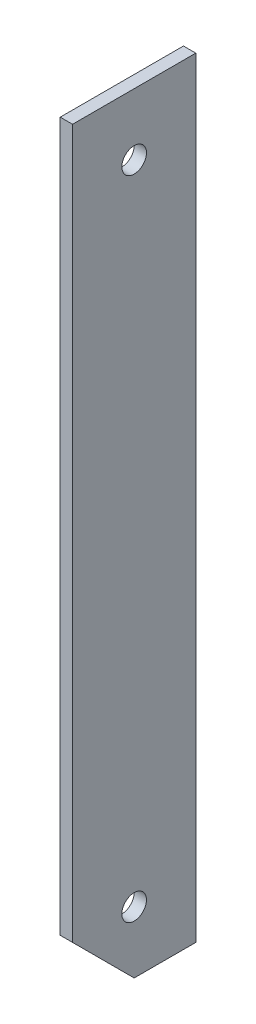
ISO-10303-21;
HEADER;
FILE_DESCRIPTION(('STEP AP214'),'2;1');
FILE_NAME('part.step','',(''),(''),'','','');
FILE_SCHEMA(('AUTOMOTIVE_DESIGN { 1 0 10303 214 1 1 1 1 }'));
ENDSEC;
DATA;
#1=APPLICATION_CONTEXT('core data for automotive mechanical design processes');
#2=APPLICATION_PROTOCOL_DEFINITION('international standard','automotive_design',2000,#1);
#3=PRODUCT_CONTEXT('',#1,'mechanical');
#4=PRODUCT('Part','Part','',(#3));
#5=PRODUCT_RELATED_PRODUCT_CATEGORY('part','',(#4));
#6=PRODUCT_DEFINITION_FORMATION('','',#4);
#7=PRODUCT_DEFINITION_CONTEXT('part definition',#1,'design');
#8=PRODUCT_DEFINITION('design','',#6,#7);
#9=PRODUCT_DEFINITION_SHAPE('','',#8);
#10=(LENGTH_UNIT() NAMED_UNIT(*) SI_UNIT(.MILLI.,.METRE.));
#11=(NAMED_UNIT(*) PLANE_ANGLE_UNIT() SI_UNIT($,.RADIAN.));
#12=(NAMED_UNIT(*) SI_UNIT($,.STERADIAN.) SOLID_ANGLE_UNIT());
#13=UNCERTAINTY_MEASURE_WITH_UNIT(LENGTH_MEASURE(1.E-05),#10,'distance_accuracy_value','');
#14=(GEOMETRIC_REPRESENTATION_CONTEXT(3) GLOBAL_UNCERTAINTY_ASSIGNED_CONTEXT((#13)) GLOBAL_UNIT_ASSIGNED_CONTEXT((#10,
#11,#12)) REPRESENTATION_CONTEXT('',''));
#15=CARTESIAN_POINT('',(0.,0.,0.));
#16=DIRECTION('',(0.,0.,1.));
#17=DIRECTION('',(1.,0.,0.));
#18=AXIS2_PLACEMENT_3D('',#15,#16,#17);
#19=CARTESIAN_POINT('',(4.,0.,0.));
#20=DIRECTION('',(1.,0.,0.));
#21=DIRECTION('',(0.,0.,-1.));
#22=AXIS2_PLACEMENT_3D('',#19,#20,#21);
#23=PLANE('',#22);
#24=CARTESIAN_POINT('',(4.,105.,0.));
#25=DIRECTION('',(1.,0.,0.));
#26=DIRECTION('',(0.,0.,-1.));
#27=AXIS2_PLACEMENT_3D('',#24,#25,#26);
#28=CIRCLE('',#27,4.00000000000001);
#29=CARTESIAN_POINT('',(4.,105.,-3.99999999999998));
#30=VERTEX_POINT('',#29);
#31=EDGE_CURVE('E140',#30,#30,#28,.T.);
#32=ORIENTED_EDGE('',*,*,#31,.F.);
#33=EDGE_LOOP('',(#32));
#34=FACE_BOUND('',#33,.T.);
#35=DIRECTION('',(0.,-1.,0.));
#36=VECTOR('',#35,1.);
#37=CARTESIAN_POINT('',(4.,125.,20.));
#38=LINE('',#37,#36);
#39=CARTESIAN_POINT('',(4.,125.,20.));
#40=VERTEX_POINT('',#39);
#41=CARTESIAN_POINT('',(4.,-105.,20.));
#42=VERTEX_POINT('',#41);
#43=EDGE_CURVE('E99',#40,#42,#38,.T.);
#44=ORIENTED_EDGE('',*,*,#43,.T.);
#45=DIRECTION('',(0.,0.707106781186548,0.707106781186547));
#46=VECTOR('',#45,1.);
#47=CARTESIAN_POINT('',(4.,-62.4999999999998,62.4999999999999));
#48=LINE('',#47,#46);
#49=CARTESIAN_POINT('',(4.,-125.,0.));
#50=VERTEX_POINT('',#49);
#51=EDGE_CURVE('E11',#42,#50,#48,.F.);
#52=ORIENTED_EDGE('',*,*,#51,.T.);
#53=DIRECTION('',(0.,0.,-1.));
#54=VECTOR('',#53,1.);
#55=CARTESIAN_POINT('',(4.,-125.,20.));
#56=LINE('',#55,#54);
#57=CARTESIAN_POINT('',(4.,-125.,-20.));
#58=VERTEX_POINT('',#57);
#59=EDGE_CURVE('E105',#50,#58,#56,.T.);
#60=ORIENTED_EDGE('',*,*,#59,.T.);
#61=DIRECTION('',(0.,1.,0.));
#62=VECTOR('',#61,1.);
#63=CARTESIAN_POINT('',(4.,125.,-20.));
#64=LINE('',#63,#62);
#65=CARTESIAN_POINT('',(4.,125.,-20.));
#66=VERTEX_POINT('',#65);
#67=EDGE_CURVE('E100',#58,#66,#64,.T.);
#68=ORIENTED_EDGE('',*,*,#67,.T.);
#69=DIRECTION('',(0.,0.,1.));
#70=VECTOR('',#69,1.);
#71=CARTESIAN_POINT('',(4.,125.,20.));
#72=LINE('',#71,#70);
#73=EDGE_CURVE('E89',#66,#40,#72,.T.);
#74=ORIENTED_EDGE('',*,*,#73,.T.);
#75=EDGE_LOOP('',(#44,#52,#60,#68,#74));
#76=FACE_BOUND('',#75,.T.);
#77=CARTESIAN_POINT('',(4.,-105.,0.));
#78=DIRECTION('',(1.,0.,0.));
#79=DIRECTION('',(0.,0.,-1.));
#80=AXIS2_PLACEMENT_3D('',#77,#78,#79);
#81=CIRCLE('',#80,4.00000000000001);
#82=CARTESIAN_POINT('',(4.,-105.,-4.00000000000004));
#83=VERTEX_POINT('',#82);
#84=EDGE_CURVE('E149',#83,#83,#81,.T.);
#85=ORIENTED_EDGE('',*,*,#84,.F.);
#86=EDGE_LOOP('',(#85));
#87=FACE_BOUND('',#86,.T.);
#88=ADVANCED_FACE('F41',(#34,#76,#87),#23,.T.);
#89=CARTESIAN_POINT('',(0.,0.,0.));
#90=DIRECTION('',(1.,0.,0.));
#91=DIRECTION('',(0.,0.,-1.));
#92=AXIS2_PLACEMENT_3D('',#89,#90,#91);
#93=PLANE('',#92);
#94=DIRECTION('',(0.,0.,-1.));
#95=VECTOR('',#94,1.);
#96=CARTESIAN_POINT('',(0.,-125.,20.));
#97=LINE('',#96,#95);
#98=CARTESIAN_POINT('',(0.,-125.,0.));
#99=VERTEX_POINT('',#98);
#100=CARTESIAN_POINT('',(0.,-125.,-20.));
#101=VERTEX_POINT('',#100);
#102=EDGE_CURVE('E110',#99,#101,#97,.T.);
#103=ORIENTED_EDGE('',*,*,#102,.F.);
#104=DIRECTION('',(0.,-0.707106781186548,-0.707106781186547));
#105=VECTOR('',#104,1.);
#106=CARTESIAN_POINT('',(0.,-125.,0.));
#107=LINE('',#106,#105);
#108=CARTESIAN_POINT('',(0.,-105.,20.));
#109=VERTEX_POINT('',#108);
#110=EDGE_CURVE('E64',#99,#109,#107,.F.);
#111=ORIENTED_EDGE('',*,*,#110,.T.);
#112=DIRECTION('',(0.,-1.,0.));
#113=VECTOR('',#112,1.);
#114=CARTESIAN_POINT('',(0.,125.,20.));
#115=LINE('',#114,#113);
#116=CARTESIAN_POINT('',(0.,125.,20.));
#117=VERTEX_POINT('',#116);
#118=EDGE_CURVE('E132',#117,#109,#115,.T.);
#119=ORIENTED_EDGE('',*,*,#118,.F.);
#120=DIRECTION('',(0.,0.,1.));
#121=VECTOR('',#120,1.);
#122=CARTESIAN_POINT('',(0.,125.,20.));
#123=LINE('',#122,#121);
#124=CARTESIAN_POINT('',(0.,125.,-20.));
#125=VERTEX_POINT('',#124);
#126=EDGE_CURVE('E135',#125,#117,#123,.T.);
#127=ORIENTED_EDGE('',*,*,#126,.F.);
#128=DIRECTION('',(0.,1.,0.));
#129=VECTOR('',#128,1.);
#130=CARTESIAN_POINT('',(0.,125.,-20.));
#131=LINE('',#130,#129);
#132=EDGE_CURVE('E114',#101,#125,#131,.T.);
#133=ORIENTED_EDGE('',*,*,#132,.F.);
#134=EDGE_LOOP('',(#103,#111,#119,#127,#133));
#135=FACE_BOUND('',#134,.T.);
#136=CARTESIAN_POINT('',(0.,105.,0.));
#137=DIRECTION('',(1.,0.,0.));
#138=DIRECTION('',(0.,0.,-1.));
#139=AXIS2_PLACEMENT_3D('',#136,#137,#138);
#140=CIRCLE('',#139,4.00000000000001);
#141=CARTESIAN_POINT('',(0.,105.,-3.99999999999998));
#142=VERTEX_POINT('',#141);
#143=EDGE_CURVE('E145',#142,#142,#140,.T.);
#144=ORIENTED_EDGE('',*,*,#143,.T.);
#145=EDGE_LOOP('',(#144));
#146=FACE_BOUND('',#145,.T.);
#147=CARTESIAN_POINT('',(0.,-105.,0.));
#148=DIRECTION('',(1.,0.,0.));
#149=DIRECTION('',(0.,0.,-1.));
#150=AXIS2_PLACEMENT_3D('',#147,#148,#149);
#151=CIRCLE('',#150,4.00000000000001);
#152=CARTESIAN_POINT('',(0.,-105.,-4.00000000000004));
#153=VERTEX_POINT('',#152);
#154=EDGE_CURVE('E153',#153,#153,#151,.T.);
#155=ORIENTED_EDGE('',*,*,#154,.T.);
#156=EDGE_LOOP('',(#155));
#157=FACE_BOUND('',#156,.T.);
#158=ADVANCED_FACE('F164',(#135,#146,#157),#93,.F.);
#159=CARTESIAN_POINT('',(4.,125.,-20.));
#160=DIRECTION('',(0.,0.,1.));
#161=DIRECTION('',(0.,-1.,0.));
#162=AXIS2_PLACEMENT_3D('',#159,#160,#161);
#163=PLANE('',#162);
#164=ORIENTED_EDGE('',*,*,#132,.T.);
#165=DIRECTION('',(-1.,0.,0.));
#166=VECTOR('',#165,1.);
#167=CARTESIAN_POINT('',(4.,125.,-20.));
#168=LINE('',#167,#166);
#169=EDGE_CURVE('E93',#66,#125,#168,.T.);
#170=ORIENTED_EDGE('',*,*,#169,.F.);
#171=ORIENTED_EDGE('',*,*,#67,.F.);
#172=DIRECTION('',(-1.,0.,0.));
#173=VECTOR('',#172,1.);
#174=CARTESIAN_POINT('',(4.,-125.,-20.));
#175=LINE('',#174,#173);
#176=EDGE_CURVE('E122',#58,#101,#175,.T.);
#177=ORIENTED_EDGE('',*,*,#176,.T.);
#178=EDGE_LOOP('',(#164,#170,#171,#177));
#179=FACE_BOUND('',#178,.T.);
#180=ADVANCED_FACE('F112',(#179),#163,.F.);
#181=CARTESIAN_POINT('',(4.,125.,20.));
#182=DIRECTION('',(0.,-1.,0.));
#183=DIRECTION('',(0.,0.,-1.));
#184=AXIS2_PLACEMENT_3D('',#181,#182,#183);
#185=PLANE('',#184);
#186=ORIENTED_EDGE('',*,*,#126,.T.);
#187=DIRECTION('',(-1.,0.,0.));
#188=VECTOR('',#187,1.);
#189=CARTESIAN_POINT('',(4.,125.,20.));
#190=LINE('',#189,#188);
#191=EDGE_CURVE('E96',#40,#117,#190,.T.);
#192=ORIENTED_EDGE('',*,*,#191,.F.);
#193=ORIENTED_EDGE('',*,*,#73,.F.);
#194=ORIENTED_EDGE('',*,*,#169,.T.);
#195=EDGE_LOOP('',(#186,#192,#193,#194));
#196=FACE_BOUND('',#195,.T.);
#197=ADVANCED_FACE('F91',(#196),#185,.F.);
#198=CARTESIAN_POINT('',(4.,125.,20.));
#199=DIRECTION('',(0.,0.,-1.));
#200=DIRECTION('',(0.,1.,0.));
#201=AXIS2_PLACEMENT_3D('',#198,#199,#200);
#202=PLANE('',#201);
#203=ORIENTED_EDGE('',*,*,#118,.T.);
#204=DIRECTION('',(1.,0.,0.));
#205=VECTOR('',#204,1.);
#206=CARTESIAN_POINT('',(4.,-105.,20.));
#207=LINE('',#206,#205);
#208=EDGE_CURVE('E50',#109,#42,#207,.T.);
#209=ORIENTED_EDGE('',*,*,#208,.T.);
#210=ORIENTED_EDGE('',*,*,#43,.F.);
#211=ORIENTED_EDGE('',*,*,#191,.T.);
#212=EDGE_LOOP('',(#203,#209,#210,#211));
#213=FACE_BOUND('',#212,.T.);
#214=ADVANCED_FACE('F179',(#213),#202,.F.);
#215=CARTESIAN_POINT('',(4.,-125.,20.));
#216=DIRECTION('',(0.,1.,0.));
#217=DIRECTION('',(0.,0.,1.));
#218=AXIS2_PLACEMENT_3D('',#215,#216,#217);
#219=PLANE('',#218);
#220=ORIENTED_EDGE('',*,*,#59,.F.);
#221=DIRECTION('',(-1.,0.,0.));
#222=VECTOR('',#221,1.);
#223=CARTESIAN_POINT('',(4.,-125.,0.));
#224=LINE('',#223,#222);
#225=EDGE_CURVE('E116',#50,#99,#224,.T.);
#226=ORIENTED_EDGE('',*,*,#225,.T.);
#227=ORIENTED_EDGE('',*,*,#102,.T.);
#228=ORIENTED_EDGE('',*,*,#176,.F.);
#229=EDGE_LOOP('',(#220,#226,#227,#228));
#230=FACE_BOUND('',#229,.T.);
#231=ADVANCED_FACE('F176',(#230),#219,.F.);
#232=CARTESIAN_POINT('',(4.,105.,0.));
#233=DIRECTION('',(-1.,0.,0.));
#234=DIRECTION('',(0.,0.,1.));
#235=AXIS2_PLACEMENT_3D('',#232,#233,#234);
#236=CYLINDRICAL_SURFACE('',#235,4.00000000000001);
#237=ORIENTED_EDGE('',*,*,#31,.T.);
#238=EDGE_LOOP('',(#237));
#239=FACE_BOUND('',#238,.T.);
#240=ORIENTED_EDGE('',*,*,#143,.F.);
#241=EDGE_LOOP('',(#240));
#242=FACE_BOUND('',#241,.T.);
#243=ADVANCED_FACE('F173',(#239,#242),#236,.F.);
#244=CARTESIAN_POINT('',(4.,-105.,0.));
#245=DIRECTION('',(-1.,0.,0.));
#246=DIRECTION('',(0.,0.,1.));
#247=AXIS2_PLACEMENT_3D('',#244,#245,#246);
#248=CYLINDRICAL_SURFACE('',#247,4.00000000000001);
#249=ORIENTED_EDGE('',*,*,#84,.T.);
#250=EDGE_LOOP('',(#249));
#251=FACE_BOUND('',#250,.T.);
#252=ORIENTED_EDGE('',*,*,#154,.F.);
#253=EDGE_LOOP('',(#252));
#254=FACE_BOUND('',#253,.T.);
#255=ADVANCED_FACE('F161',(#251,#254),#248,.F.);
#256=CARTESIAN_POINT('',(4.,-125.,0.));
#257=DIRECTION('',(0.,0.707106781186547,-0.707106781186548));
#258=DIRECTION('',(-1.,0.,0.));
#259=AXIS2_PLACEMENT_3D('',#256,#257,#258);
#260=PLANE('',#259);
#261=ORIENTED_EDGE('',*,*,#51,.F.);
#262=ORIENTED_EDGE('',*,*,#208,.F.);
#263=ORIENTED_EDGE('',*,*,#110,.F.);
#264=ORIENTED_EDGE('',*,*,#225,.F.);
#265=EDGE_LOOP('',(#261,#262,#263,#264));
#266=FACE_BOUND('',#265,.T.);
#267=ADVANCED_FACE('F43',(#266),#260,.F.);
#268=CLOSED_SHELL('',(#88,#158,#180,#197,#214,#231,#243,#255,#267));
#269=MANIFOLD_SOLID_BREP('B2',#268);
#270=ADVANCED_BREP_SHAPE_REPRESENTATION('',(#18,#269),#14);
#271=SHAPE_DEFINITION_REPRESENTATION(#9,#270);
ENDSEC;
END-ISO-10303-21;
